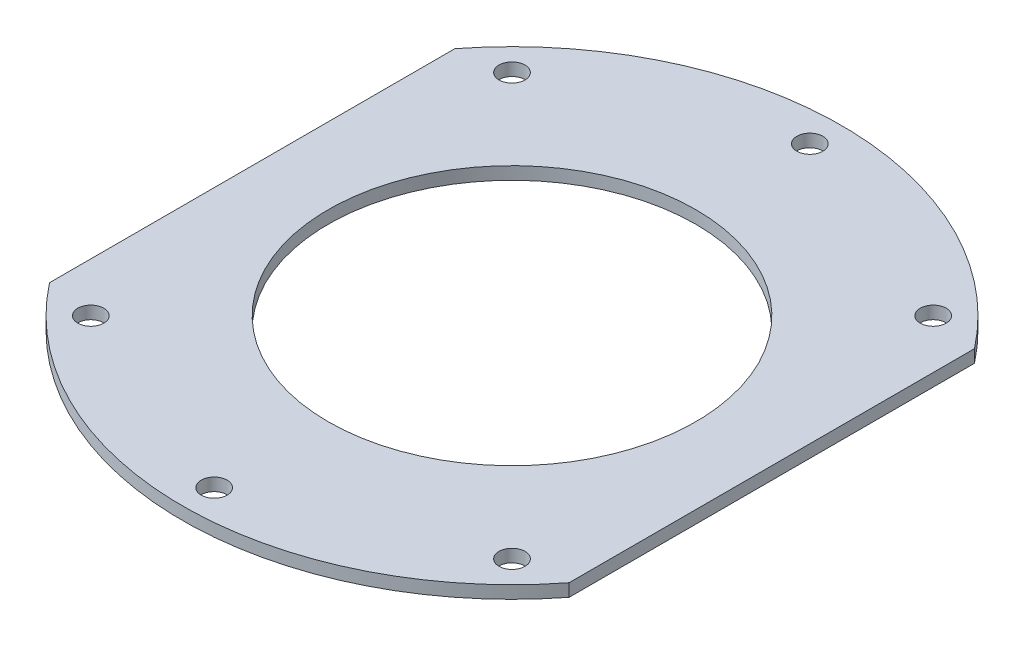
ISO-10303-21;
HEADER;
FILE_DESCRIPTION(('STEP AP214'),'2;1');
FILE_NAME('part.step','',(''),(''),'','','');
FILE_SCHEMA(('AUTOMOTIVE_DESIGN { 1 0 10303 214 1 1 1 1 }'));
ENDSEC;
DATA;
#1=APPLICATION_CONTEXT('core data for automotive mechanical design processes');
#2=APPLICATION_PROTOCOL_DEFINITION('international standard','automotive_design',2000,#1);
#3=PRODUCT_CONTEXT('',#1,'mechanical');
#4=PRODUCT('Part','Part','',(#3));
#5=PRODUCT_RELATED_PRODUCT_CATEGORY('part','',(#4));
#6=PRODUCT_DEFINITION_FORMATION('','',#4);
#7=PRODUCT_DEFINITION_CONTEXT('part definition',#1,'design');
#8=PRODUCT_DEFINITION('design','',#6,#7);
#9=PRODUCT_DEFINITION_SHAPE('','',#8);
#10=(LENGTH_UNIT() NAMED_UNIT(*) SI_UNIT(.MILLI.,.METRE.));
#11=(NAMED_UNIT(*) PLANE_ANGLE_UNIT() SI_UNIT($,.RADIAN.));
#12=(NAMED_UNIT(*) SI_UNIT($,.STERADIAN.) SOLID_ANGLE_UNIT());
#13=UNCERTAINTY_MEASURE_WITH_UNIT(LENGTH_MEASURE(1.E-05),#10,'distance_accuracy_value','');
#14=(GEOMETRIC_REPRESENTATION_CONTEXT(3) GLOBAL_UNCERTAINTY_ASSIGNED_CONTEXT((#13)) GLOBAL_UNIT_ASSIGNED_CONTEXT((#10,
#11,#12)) REPRESENTATION_CONTEXT('',''));
#15=CARTESIAN_POINT('',(0.,0.,0.));
#16=DIRECTION('',(0.,0.,1.));
#17=DIRECTION('',(1.,0.,0.));
#18=AXIS2_PLACEMENT_3D('',#15,#16,#17);
#19=CARTESIAN_POINT('',(0.,2.,0.));
#20=DIRECTION('',(0.,1.,0.));
#21=DIRECTION('',(0.,0.,1.));
#22=AXIS2_PLACEMENT_3D('',#19,#20,#21);
#23=PLANE('',#22);
#24=CARTESIAN_POINT('',(0.,2.,-47.));
#25=DIRECTION('',(0.,1.,0.));
#26=DIRECTION('',(0.,0.,1.));
#27=AXIS2_PLACEMENT_3D('',#24,#25,#26);
#28=CIRCLE('',#27,2.05);
#29=CARTESIAN_POINT('',(0.,2.,-44.95));
#30=VERTEX_POINT('',#29);
#31=EDGE_CURVE('E266',#30,#30,#28,.T.);
#32=ORIENTED_EDGE('',*,*,#31,.F.);
#33=EDGE_LOOP('',(#32));
#34=FACE_BOUND('',#33,.T.);
#35=CARTESIAN_POINT('',(0.,2.,47.));
#36=DIRECTION('',(0.,1.,0.));
#37=DIRECTION('',(0.,0.,1.));
#38=AXIS2_PLACEMENT_3D('',#35,#36,#37);
#39=CIRCLE('',#38,2.05);
#40=CARTESIAN_POINT('',(0.,2.,49.05));
#41=VERTEX_POINT('',#40);
#42=EDGE_CURVE('E284',#41,#41,#39,.T.);
#43=ORIENTED_EDGE('',*,*,#42,.F.);
#44=EDGE_LOOP('',(#43));
#45=FACE_BOUND('',#44,.T.);
#46=CARTESIAN_POINT('',(0.,2.,0.));
#47=DIRECTION('',(0.,1.,0.));
#48=DIRECTION('',(0.,0.,1.));
#49=AXIS2_PLACEMENT_3D('',#46,#47,#48);
#50=CIRCLE('',#49,29.);
#51=CARTESIAN_POINT('',(0.,2.,29.));
#52=VERTEX_POINT('',#51);
#53=EDGE_CURVE('E123',#52,#52,#50,.T.);
#54=ORIENTED_EDGE('',*,*,#53,.F.);
#55=EDGE_LOOP('',(#54));
#56=FACE_BOUND('',#55,.T.);
#57=CARTESIAN_POINT('',(33.2340187157677,2.,33.2340187157677));
#58=DIRECTION('',(0.,1.,0.));
#59=DIRECTION('',(0.,0.,1.));
#60=AXIS2_PLACEMENT_3D('',#57,#58,#59);
#61=CIRCLE('',#60,2.05);
#62=CARTESIAN_POINT('',(33.2340187157677,2.,35.2840187157677));
#63=VERTEX_POINT('',#62);
#64=EDGE_CURVE('E290',#63,#63,#61,.T.);
#65=ORIENTED_EDGE('',*,*,#64,.F.);
#66=EDGE_LOOP('',(#65));
#67=FACE_BOUND('',#66,.T.);
#68=CARTESIAN_POINT('',(-33.2340187157677,2.,33.2340187157677));
#69=DIRECTION('',(0.,1.,0.));
#70=DIRECTION('',(0.,0.,1.));
#71=AXIS2_PLACEMENT_3D('',#68,#69,#70);
#72=CIRCLE('',#71,2.05);
#73=CARTESIAN_POINT('',(-33.2340187157677,2.,35.2840187157677));
#74=VERTEX_POINT('',#73);
#75=EDGE_CURVE('E278',#74,#74,#72,.T.);
#76=ORIENTED_EDGE('',*,*,#75,.F.);
#77=EDGE_LOOP('',(#76));
#78=FACE_BOUND('',#77,.T.);
#79=CARTESIAN_POINT('',(-33.2340187157677,2.,-33.2340187157677));
#80=DIRECTION('',(0.,1.,0.));
#81=DIRECTION('',(0.,0.,1.));
#82=AXIS2_PLACEMENT_3D('',#79,#80,#81);
#83=CIRCLE('',#82,2.05);
#84=CARTESIAN_POINT('',(-33.2340187157677,2.,-31.1840187157677));
#85=VERTEX_POINT('',#84);
#86=EDGE_CURVE('E272',#85,#85,#83,.T.);
#87=ORIENTED_EDGE('',*,*,#86,.F.);
#88=EDGE_LOOP('',(#87));
#89=FACE_BOUND('',#88,.T.);
#90=CARTESIAN_POINT('',(33.2340187157677,2.,-33.2340187157677));
#91=DIRECTION('',(0.,1.,0.));
#92=DIRECTION('',(0.,0.,1.));
#93=AXIS2_PLACEMENT_3D('',#90,#91,#92);
#94=CIRCLE('',#93,2.05);
#95=CARTESIAN_POINT('',(33.2340187157677,2.,-31.1840187157677));
#96=VERTEX_POINT('',#95);
#97=EDGE_CURVE('E256',#96,#96,#94,.T.);
#98=ORIENTED_EDGE('',*,*,#97,.F.);
#99=EDGE_LOOP('',(#98));
#100=FACE_BOUND('',#99,.T.);
#101=CARTESIAN_POINT('',(0.,2.,0.));
#102=DIRECTION('',(0.,1.,0.));
#103=DIRECTION('',(0.,0.,1.));
#104=AXIS2_PLACEMENT_3D('',#101,#102,#103);
#105=CIRCLE('',#104,52.);
#106=CARTESIAN_POINT('',(-41.,2.,31.984371183439));
#107=VERTEX_POINT('',#106);
#108=CARTESIAN_POINT('',(41.,2.,31.984371183439));
#109=VERTEX_POINT('',#108);
#110=EDGE_CURVE('E109',#107,#109,#105,.T.);
#111=ORIENTED_EDGE('',*,*,#110,.T.);
#112=DIRECTION('',(0.,0.,-1.));
#113=VECTOR('',#112,1.);
#114=CARTESIAN_POINT('',(41.,2.,55.0176136765046));
#115=LINE('',#114,#113);
#116=CARTESIAN_POINT('',(41.,2.,-31.984371183439));
#117=VERTEX_POINT('',#116);
#118=EDGE_CURVE('E97',#109,#117,#115,.T.);
#119=ORIENTED_EDGE('',*,*,#118,.T.);
#120=CARTESIAN_POINT('',(-41.,2.,-31.984371183439));
#121=VERTEX_POINT('',#120);
#122=EDGE_CURVE('E113',#117,#121,#105,.T.);
#123=ORIENTED_EDGE('',*,*,#122,.T.);
#124=DIRECTION('',(0.,0.,1.));
#125=VECTOR('',#124,1.);
#126=CARTESIAN_POINT('',(-41.,2.,55.0176136765046));
#127=LINE('',#126,#125);
#128=EDGE_CURVE('E104',#121,#107,#127,.T.);
#129=ORIENTED_EDGE('',*,*,#128,.T.);
#130=EDGE_LOOP('',(#111,#119,#123,#129));
#131=FACE_BOUND('',#130,.T.);
#132=ADVANCED_FACE('F59',(#34,#45,#56,#67,#78,#89,#100,#131),#23,.T.);
#133=CARTESIAN_POINT('',(0.,0.,0.));
#134=DIRECTION('',(0.,1.,0.));
#135=DIRECTION('',(0.,0.,1.));
#136=AXIS2_PLACEMENT_3D('',#133,#134,#135);
#137=PLANE('',#136);
#138=CARTESIAN_POINT('',(0.,0.,0.));
#139=DIRECTION('',(0.,1.,0.));
#140=DIRECTION('',(0.,0.,1.));
#141=AXIS2_PLACEMENT_3D('',#138,#139,#140);
#142=CIRCLE('',#141,29.);
#143=CARTESIAN_POINT('',(0.,0.,29.));
#144=VERTEX_POINT('',#143);
#145=EDGE_CURVE('E120',#144,#144,#142,.T.);
#146=ORIENTED_EDGE('',*,*,#145,.T.);
#147=EDGE_LOOP('',(#146));
#148=FACE_BOUND('',#147,.T.);
#149=CARTESIAN_POINT('',(33.2340187157677,0.,33.2340187157677));
#150=DIRECTION('',(0.,1.,0.));
#151=DIRECTION('',(0.,0.,1.));
#152=AXIS2_PLACEMENT_3D('',#149,#150,#151);
#153=CIRCLE('',#152,2.05);
#154=CARTESIAN_POINT('',(33.2340187157677,0.,35.2840187157677));
#155=VERTEX_POINT('',#154);
#156=EDGE_CURVE('E287',#155,#155,#153,.T.);
#157=ORIENTED_EDGE('',*,*,#156,.T.);
#158=EDGE_LOOP('',(#157));
#159=FACE_BOUND('',#158,.T.);
#160=CARTESIAN_POINT('',(0.,0.,47.));
#161=DIRECTION('',(0.,1.,0.));
#162=DIRECTION('',(0.,0.,1.));
#163=AXIS2_PLACEMENT_3D('',#160,#161,#162);
#164=CIRCLE('',#163,2.05);
#165=CARTESIAN_POINT('',(0.,0.,49.05));
#166=VERTEX_POINT('',#165);
#167=EDGE_CURVE('E281',#166,#166,#164,.T.);
#168=ORIENTED_EDGE('',*,*,#167,.T.);
#169=EDGE_LOOP('',(#168));
#170=FACE_BOUND('',#169,.T.);
#171=CARTESIAN_POINT('',(-33.2340187157677,0.,33.2340187157677));
#172=DIRECTION('',(0.,1.,0.));
#173=DIRECTION('',(0.,0.,1.));
#174=AXIS2_PLACEMENT_3D('',#171,#172,#173);
#175=CIRCLE('',#174,2.05);
#176=CARTESIAN_POINT('',(-33.2340187157677,0.,35.2840187157677));
#177=VERTEX_POINT('',#176);
#178=EDGE_CURVE('E275',#177,#177,#175,.T.);
#179=ORIENTED_EDGE('',*,*,#178,.T.);
#180=EDGE_LOOP('',(#179));
#181=FACE_BOUND('',#180,.T.);
#182=CARTESIAN_POINT('',(-33.2340187157677,0.,-33.2340187157677));
#183=DIRECTION('',(0.,1.,0.));
#184=DIRECTION('',(0.,0.,1.));
#185=AXIS2_PLACEMENT_3D('',#182,#183,#184);
#186=CIRCLE('',#185,2.05);
#187=CARTESIAN_POINT('',(-33.2340187157677,0.,-31.1840187157677));
#188=VERTEX_POINT('',#187);
#189=EDGE_CURVE('E269',#188,#188,#186,.T.);
#190=ORIENTED_EDGE('',*,*,#189,.T.);
#191=EDGE_LOOP('',(#190));
#192=FACE_BOUND('',#191,.T.);
#193=CARTESIAN_POINT('',(0.,0.,-47.));
#194=DIRECTION('',(0.,1.,0.));
#195=DIRECTION('',(0.,0.,1.));
#196=AXIS2_PLACEMENT_3D('',#193,#194,#195);
#197=CIRCLE('',#196,2.05);
#198=CARTESIAN_POINT('',(0.,0.,-44.95));
#199=VERTEX_POINT('',#198);
#200=EDGE_CURVE('E262',#199,#199,#197,.T.);
#201=ORIENTED_EDGE('',*,*,#200,.T.);
#202=EDGE_LOOP('',(#201));
#203=FACE_BOUND('',#202,.T.);
#204=CARTESIAN_POINT('',(33.2340187157677,0.,-33.2340187157677));
#205=DIRECTION('',(0.,1.,0.));
#206=DIRECTION('',(0.,0.,1.));
#207=AXIS2_PLACEMENT_3D('',#204,#205,#206);
#208=CIRCLE('',#207,2.05);
#209=CARTESIAN_POINT('',(33.2340187157677,0.,-31.1840187157677));
#210=VERTEX_POINT('',#209);
#211=EDGE_CURVE('E259',#210,#210,#208,.T.);
#212=ORIENTED_EDGE('',*,*,#211,.T.);
#213=EDGE_LOOP('',(#212));
#214=FACE_BOUND('',#213,.T.);
#215=DIRECTION('',(0.,0.,-1.));
#216=VECTOR('',#215,1.);
#217=CARTESIAN_POINT('',(41.,0.,0.));
#218=LINE('',#217,#216);
#219=CARTESIAN_POINT('',(41.,0.,31.984371183439));
#220=VERTEX_POINT('',#219);
#221=CARTESIAN_POINT('',(41.,0.,-31.984371183439));
#222=VERTEX_POINT('',#221);
#223=EDGE_CURVE('E81',#220,#222,#218,.T.);
#224=ORIENTED_EDGE('',*,*,#223,.F.);
#225=CARTESIAN_POINT('',(0.,0.,0.));
#226=DIRECTION('',(0.,1.,0.));
#227=DIRECTION('',(0.,0.,1.));
#228=AXIS2_PLACEMENT_3D('',#225,#226,#227);
#229=CIRCLE('',#228,52.);
#230=CARTESIAN_POINT('',(-41.,0.,31.984371183439));
#231=VERTEX_POINT('',#230);
#232=EDGE_CURVE('E111',#231,#220,#229,.T.);
#233=ORIENTED_EDGE('',*,*,#232,.F.);
#234=DIRECTION('',(0.,0.,1.));
#235=VECTOR('',#234,1.);
#236=CARTESIAN_POINT('',(-41.,0.,0.));
#237=LINE('',#236,#235);
#238=CARTESIAN_POINT('',(-41.,0.,-31.984371183439));
#239=VERTEX_POINT('',#238);
#240=EDGE_CURVE('E74',#239,#231,#237,.T.);
#241=ORIENTED_EDGE('',*,*,#240,.F.);
#242=EDGE_CURVE('E114',#222,#239,#229,.T.);
#243=ORIENTED_EDGE('',*,*,#242,.F.);
#244=EDGE_LOOP('',(#224,#233,#241,#243));
#245=FACE_BOUND('',#244,.T.);
#246=ADVANCED_FACE('F131',(#148,#159,#170,#181,#192,#203,#214,#245),#137,.F.);
#247=CARTESIAN_POINT('',(0.,2.,0.));
#248=DIRECTION('',(0.,-1.,0.));
#249=DIRECTION('',(0.,0.,-1.));
#250=AXIS2_PLACEMENT_3D('',#247,#248,#249);
#251=CYLINDRICAL_SURFACE('',#250,52.);
#252=DIRECTION('',(0.,-1.,0.));
#253=VECTOR('',#252,1.);
#254=CARTESIAN_POINT('',(41.,2.,31.984371183439));
#255=LINE('',#254,#253);
#256=EDGE_CURVE('E12',#109,#220,#255,.T.);
#257=ORIENTED_EDGE('',*,*,#256,.F.);
#258=ORIENTED_EDGE('',*,*,#110,.F.);
#259=DIRECTION('',(0.,-1.,0.));
#260=VECTOR('',#259,1.);
#261=CARTESIAN_POINT('',(-41.,2.,31.984371183439));
#262=LINE('',#261,#260);
#263=EDGE_CURVE('E116',#231,#107,#262,.F.);
#264=ORIENTED_EDGE('',*,*,#263,.F.);
#265=ORIENTED_EDGE('',*,*,#232,.T.);
#266=EDGE_LOOP('',(#257,#258,#264,#265));
#267=FACE_BOUND('',#266,.T.);
#268=ADVANCED_FACE('F61',(#267),#251,.T.);
#269=DIRECTION('',(0.,-1.,0.));
#270=VECTOR('',#269,1.);
#271=CARTESIAN_POINT('',(41.,2.,-31.984371183439));
#272=LINE('',#271,#270);
#273=EDGE_CURVE('E67',#222,#117,#272,.F.);
#274=ORIENTED_EDGE('',*,*,#273,.F.);
#275=ORIENTED_EDGE('',*,*,#242,.T.);
#276=DIRECTION('',(0.,-1.,0.));
#277=VECTOR('',#276,1.);
#278=CARTESIAN_POINT('',(-41.,2.,-31.984371183439));
#279=LINE('',#278,#277);
#280=EDGE_CURVE('E125',#121,#239,#279,.T.);
#281=ORIENTED_EDGE('',*,*,#280,.F.);
#282=ORIENTED_EDGE('',*,*,#122,.F.);
#283=EDGE_LOOP('',(#274,#275,#281,#282));
#284=FACE_BOUND('',#283,.T.);
#285=ADVANCED_FACE('F133',(#284),#251,.T.);
#286=CARTESIAN_POINT('',(0.,2.,0.));
#287=DIRECTION('',(0.,-1.,0.));
#288=DIRECTION('',(0.,0.,-1.));
#289=AXIS2_PLACEMENT_3D('',#286,#287,#288);
#290=CYLINDRICAL_SURFACE('',#289,29.);
#291=ORIENTED_EDGE('',*,*,#53,.T.);
#292=EDGE_LOOP('',(#291));
#293=FACE_BOUND('',#292,.T.);
#294=ORIENTED_EDGE('',*,*,#145,.F.);
#295=EDGE_LOOP('',(#294));
#296=FACE_BOUND('',#295,.T.);
#297=ADVANCED_FACE('F135',(#293,#296),#290,.F.);
#298=CARTESIAN_POINT('',(33.2340187157677,2.,33.2340187157677));
#299=DIRECTION('',(0.,-1.,0.));
#300=DIRECTION('',(0.,0.,-1.));
#301=AXIS2_PLACEMENT_3D('',#298,#299,#300);
#302=CYLINDRICAL_SURFACE('',#301,2.05);
#303=ORIENTED_EDGE('',*,*,#64,.T.);
#304=EDGE_LOOP('',(#303));
#305=FACE_BOUND('',#304,.T.);
#306=ORIENTED_EDGE('',*,*,#156,.F.);
#307=EDGE_LOOP('',(#306));
#308=FACE_BOUND('',#307,.T.);
#309=ADVANCED_FACE('F140',(#305,#308),#302,.F.);
#310=CARTESIAN_POINT('',(0.,2.,47.));
#311=DIRECTION('',(0.,-1.,0.));
#312=DIRECTION('',(0.,0.,-1.));
#313=AXIS2_PLACEMENT_3D('',#310,#311,#312);
#314=CYLINDRICAL_SURFACE('',#313,2.05);
#315=ORIENTED_EDGE('',*,*,#42,.T.);
#316=EDGE_LOOP('',(#315));
#317=FACE_BOUND('',#316,.T.);
#318=ORIENTED_EDGE('',*,*,#167,.F.);
#319=EDGE_LOOP('',(#318));
#320=FACE_BOUND('',#319,.T.);
#321=ADVANCED_FACE('F155',(#317,#320),#314,.F.);
#322=CARTESIAN_POINT('',(-33.2340187157677,2.,33.2340187157677));
#323=DIRECTION('',(0.,-1.,0.));
#324=DIRECTION('',(0.,0.,-1.));
#325=AXIS2_PLACEMENT_3D('',#322,#323,#324);
#326=CYLINDRICAL_SURFACE('',#325,2.05);
#327=ORIENTED_EDGE('',*,*,#75,.T.);
#328=EDGE_LOOP('',(#327));
#329=FACE_BOUND('',#328,.T.);
#330=ORIENTED_EDGE('',*,*,#178,.F.);
#331=EDGE_LOOP('',(#330));
#332=FACE_BOUND('',#331,.T.);
#333=ADVANCED_FACE('F159',(#329,#332),#326,.F.);
#334=CARTESIAN_POINT('',(-33.2340187157677,2.,-33.2340187157677));
#335=DIRECTION('',(0.,-1.,0.));
#336=DIRECTION('',(0.,0.,-1.));
#337=AXIS2_PLACEMENT_3D('',#334,#335,#336);
#338=CYLINDRICAL_SURFACE('',#337,2.05);
#339=ORIENTED_EDGE('',*,*,#86,.T.);
#340=EDGE_LOOP('',(#339));
#341=FACE_BOUND('',#340,.T.);
#342=ORIENTED_EDGE('',*,*,#189,.F.);
#343=EDGE_LOOP('',(#342));
#344=FACE_BOUND('',#343,.T.);
#345=ADVANCED_FACE('F163',(#341,#344),#338,.F.);
#346=CARTESIAN_POINT('',(0.,2.,-47.));
#347=DIRECTION('',(0.,-1.,0.));
#348=DIRECTION('',(0.,0.,-1.));
#349=AXIS2_PLACEMENT_3D('',#346,#347,#348);
#350=CYLINDRICAL_SURFACE('',#349,2.05);
#351=ORIENTED_EDGE('',*,*,#31,.T.);
#352=EDGE_LOOP('',(#351));
#353=FACE_BOUND('',#352,.T.);
#354=ORIENTED_EDGE('',*,*,#200,.F.);
#355=EDGE_LOOP('',(#354));
#356=FACE_BOUND('',#355,.T.);
#357=ADVANCED_FACE('F167',(#353,#356),#350,.F.);
#358=CARTESIAN_POINT('',(33.2340187157677,2.,-33.2340187157677));
#359=DIRECTION('',(0.,-1.,0.));
#360=DIRECTION('',(0.,0.,-1.));
#361=AXIS2_PLACEMENT_3D('',#358,#359,#360);
#362=CYLINDRICAL_SURFACE('',#361,2.05);
#363=ORIENTED_EDGE('',*,*,#97,.T.);
#364=EDGE_LOOP('',(#363));
#365=FACE_BOUND('',#364,.T.);
#366=ORIENTED_EDGE('',*,*,#211,.F.);
#367=EDGE_LOOP('',(#366));
#368=FACE_BOUND('',#367,.T.);
#369=ADVANCED_FACE('F171',(#365,#368),#362,.F.);
#370=CARTESIAN_POINT('',(-41.,-8.,55.0176136765046));
#371=DIRECTION('',(-1.,0.,0.));
#372=DIRECTION('',(0.,0.,1.));
#373=AXIS2_PLACEMENT_3D('',#370,#371,#372);
#374=PLANE('',#373);
#375=ORIENTED_EDGE('',*,*,#280,.T.);
#376=ORIENTED_EDGE('',*,*,#240,.T.);
#377=ORIENTED_EDGE('',*,*,#263,.T.);
#378=ORIENTED_EDGE('',*,*,#128,.F.);
#379=EDGE_LOOP('',(#375,#376,#377,#378));
#380=FACE_BOUND('',#379,.T.);
#381=ADVANCED_FACE('F127',(#380),#374,.T.);
#382=CARTESIAN_POINT('',(41.,-8.,55.0176136765046));
#383=DIRECTION('',(1.,0.,0.));
#384=DIRECTION('',(0.,0.,-1.));
#385=AXIS2_PLACEMENT_3D('',#382,#383,#384);
#386=PLANE('',#385);
#387=ORIENTED_EDGE('',*,*,#256,.T.);
#388=ORIENTED_EDGE('',*,*,#223,.T.);
#389=ORIENTED_EDGE('',*,*,#273,.T.);
#390=ORIENTED_EDGE('',*,*,#118,.F.);
#391=EDGE_LOOP('',(#387,#388,#389,#390));
#392=FACE_BOUND('',#391,.T.);
#393=ADVANCED_FACE('F99',(#392),#386,.T.);
#394=CLOSED_SHELL('',(#132,#246,#268,#285,#297,#309,#321,#333,#345,#357,#369,#381,#393));
#395=MANIFOLD_SOLID_BREP('B2',#394);
#396=ADVANCED_BREP_SHAPE_REPRESENTATION('',(#18,#395),#14);
#397=SHAPE_DEFINITION_REPRESENTATION(#9,#396);
ENDSEC;
END-ISO-10303-21;
